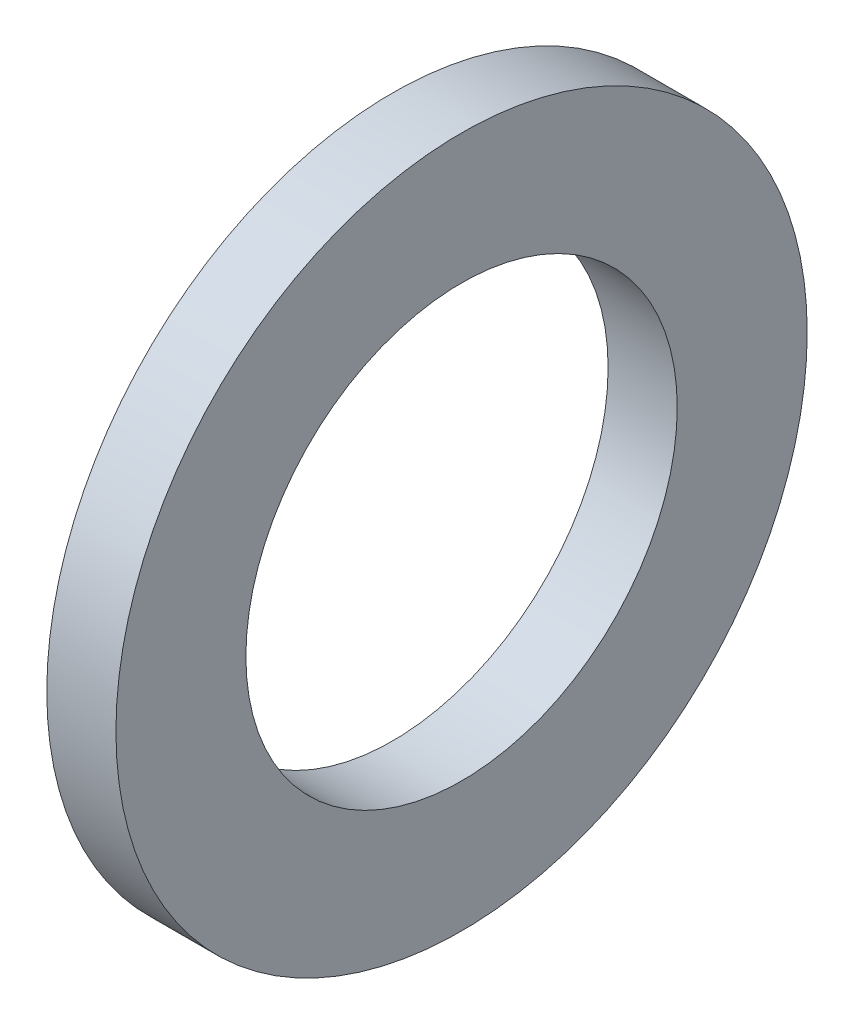
ISO-10303-21;
HEADER;
FILE_DESCRIPTION(('STEP AP214'),'2;1');
FILE_NAME('part.step','',(''),(''),'','','');
FILE_SCHEMA(('AUTOMOTIVE_DESIGN { 1 0 10303 214 1 1 1 1 }'));
ENDSEC;
DATA;
#1=APPLICATION_CONTEXT('core data for automotive mechanical design processes');
#2=APPLICATION_PROTOCOL_DEFINITION('international standard','automotive_design',2000,#1);
#3=PRODUCT_CONTEXT('',#1,'mechanical');
#4=PRODUCT('Part','Part','',(#3));
#5=PRODUCT_RELATED_PRODUCT_CATEGORY('part','',(#4));
#6=PRODUCT_DEFINITION_FORMATION('','',#4);
#7=PRODUCT_DEFINITION_CONTEXT('part definition',#1,'design');
#8=PRODUCT_DEFINITION('design','',#6,#7);
#9=PRODUCT_DEFINITION_SHAPE('','',#8);
#10=(LENGTH_UNIT() NAMED_UNIT(*) SI_UNIT(.MILLI.,.METRE.));
#11=(NAMED_UNIT(*) PLANE_ANGLE_UNIT() SI_UNIT($,.RADIAN.));
#12=(NAMED_UNIT(*) SI_UNIT($,.STERADIAN.) SOLID_ANGLE_UNIT());
#13=UNCERTAINTY_MEASURE_WITH_UNIT(LENGTH_MEASURE(1.E-05),#10,'distance_accuracy_value','');
#14=(GEOMETRIC_REPRESENTATION_CONTEXT(3) GLOBAL_UNCERTAINTY_ASSIGNED_CONTEXT((#13)) GLOBAL_UNIT_ASSIGNED_CONTEXT((#10,
#11,#12)) REPRESENTATION_CONTEXT('',''));
#15=CARTESIAN_POINT('',(0.,0.,0.));
#16=DIRECTION('',(0.,0.,1.));
#17=DIRECTION('',(1.,0.,0.));
#18=AXIS2_PLACEMENT_3D('',#15,#16,#17);
#19=CARTESIAN_POINT('',(1.5875,0.,0.));
#20=DIRECTION('',(1.,0.,0.));
#21=DIRECTION('',(0.,0.,-1.));
#22=AXIS2_PLACEMENT_3D('',#19,#20,#21);
#23=PLANE('',#22);
#24=CARTESIAN_POINT('',(1.5875,0.,0.));
#25=DIRECTION('',(1.,0.,0.));
#26=DIRECTION('',(0.,0.,-1.));
#27=AXIS2_PLACEMENT_3D('',#24,#25,#26);
#28=CIRCLE('',#27,7.9375);
#29=CARTESIAN_POINT('',(1.5875,0.,-7.9375));
#30=VERTEX_POINT('',#29);
#31=EDGE_CURVE('E10',#30,#30,#28,.T.);
#32=ORIENTED_EDGE('',*,*,#31,.T.);
#33=EDGE_LOOP('',(#32));
#34=FACE_BOUND('',#33,.T.);
#35=CARTESIAN_POINT('',(1.5875,0.,0.));
#36=DIRECTION('',(1.,0.,0.));
#37=DIRECTION('',(0.,0.,-1.));
#38=AXIS2_PLACEMENT_3D('',#35,#36,#37);
#39=CIRCLE('',#38,4.953);
#40=CARTESIAN_POINT('',(1.5875,0.,-4.953));
#41=VERTEX_POINT('',#40);
#42=EDGE_CURVE('E52',#41,#41,#39,.T.);
#43=ORIENTED_EDGE('',*,*,#42,.F.);
#44=EDGE_LOOP('',(#43));
#45=FACE_BOUND('',#44,.T.);
#46=ADVANCED_FACE('F41',(#34,#45),#23,.T.);
#47=CARTESIAN_POINT('',(0.,0.,0.));
#48=DIRECTION('',(1.,0.,0.));
#49=DIRECTION('',(0.,0.,-1.));
#50=AXIS2_PLACEMENT_3D('',#47,#48,#49);
#51=PLANE('',#50);
#52=CARTESIAN_POINT('',(0.,0.,0.));
#53=DIRECTION('',(1.,0.,0.));
#54=DIRECTION('',(0.,0.,-1.));
#55=AXIS2_PLACEMENT_3D('',#52,#53,#54);
#56=CIRCLE('',#55,7.9375);
#57=CARTESIAN_POINT('',(0.,0.,-7.9375));
#58=VERTEX_POINT('',#57);
#59=EDGE_CURVE('E45',#58,#58,#56,.T.);
#60=ORIENTED_EDGE('',*,*,#59,.F.);
#61=EDGE_LOOP('',(#60));
#62=FACE_BOUND('',#61,.T.);
#63=CARTESIAN_POINT('',(0.,0.,0.));
#64=DIRECTION('',(1.,0.,0.));
#65=DIRECTION('',(0.,0.,-1.));
#66=AXIS2_PLACEMENT_3D('',#63,#64,#65);
#67=CIRCLE('',#66,4.953);
#68=CARTESIAN_POINT('',(0.,0.,-4.953));
#69=VERTEX_POINT('',#68);
#70=EDGE_CURVE('E54',#69,#69,#67,.T.);
#71=ORIENTED_EDGE('',*,*,#70,.T.);
#72=EDGE_LOOP('',(#71));
#73=FACE_BOUND('',#72,.T.);
#74=ADVANCED_FACE('F64',(#62,#73),#51,.F.);
#75=CARTESIAN_POINT('',(1.5875,0.,0.));
#76=DIRECTION('',(-1.,0.,0.));
#77=DIRECTION('',(0.,0.,1.));
#78=AXIS2_PLACEMENT_3D('',#75,#76,#77);
#79=CYLINDRICAL_SURFACE('',#78,7.9375);
#80=ORIENTED_EDGE('',*,*,#31,.F.);
#81=EDGE_LOOP('',(#80));
#82=FACE_BOUND('',#81,.T.);
#83=ORIENTED_EDGE('',*,*,#59,.T.);
#84=EDGE_LOOP('',(#83));
#85=FACE_BOUND('',#84,.T.);
#86=ADVANCED_FACE('F43',(#82,#85),#79,.T.);
#87=CARTESIAN_POINT('',(1.5875,0.,0.));
#88=DIRECTION('',(-1.,0.,0.));
#89=DIRECTION('',(0.,0.,1.));
#90=AXIS2_PLACEMENT_3D('',#87,#88,#89);
#91=CYLINDRICAL_SURFACE('',#90,4.953);
#92=ORIENTED_EDGE('',*,*,#42,.T.);
#93=EDGE_LOOP('',(#92));
#94=FACE_BOUND('',#93,.T.);
#95=ORIENTED_EDGE('',*,*,#70,.F.);
#96=EDGE_LOOP('',(#95));
#97=FACE_BOUND('',#96,.T.);
#98=ADVANCED_FACE('F60',(#94,#97),#91,.F.);
#99=CLOSED_SHELL('',(#46,#74,#86,#98));
#100=MANIFOLD_SOLID_BREP('B2',#99);
#101=ADVANCED_BREP_SHAPE_REPRESENTATION('',(#18,#100),#14);
#102=SHAPE_DEFINITION_REPRESENTATION(#9,#101);
ENDSEC;
END-ISO-10303-21;
